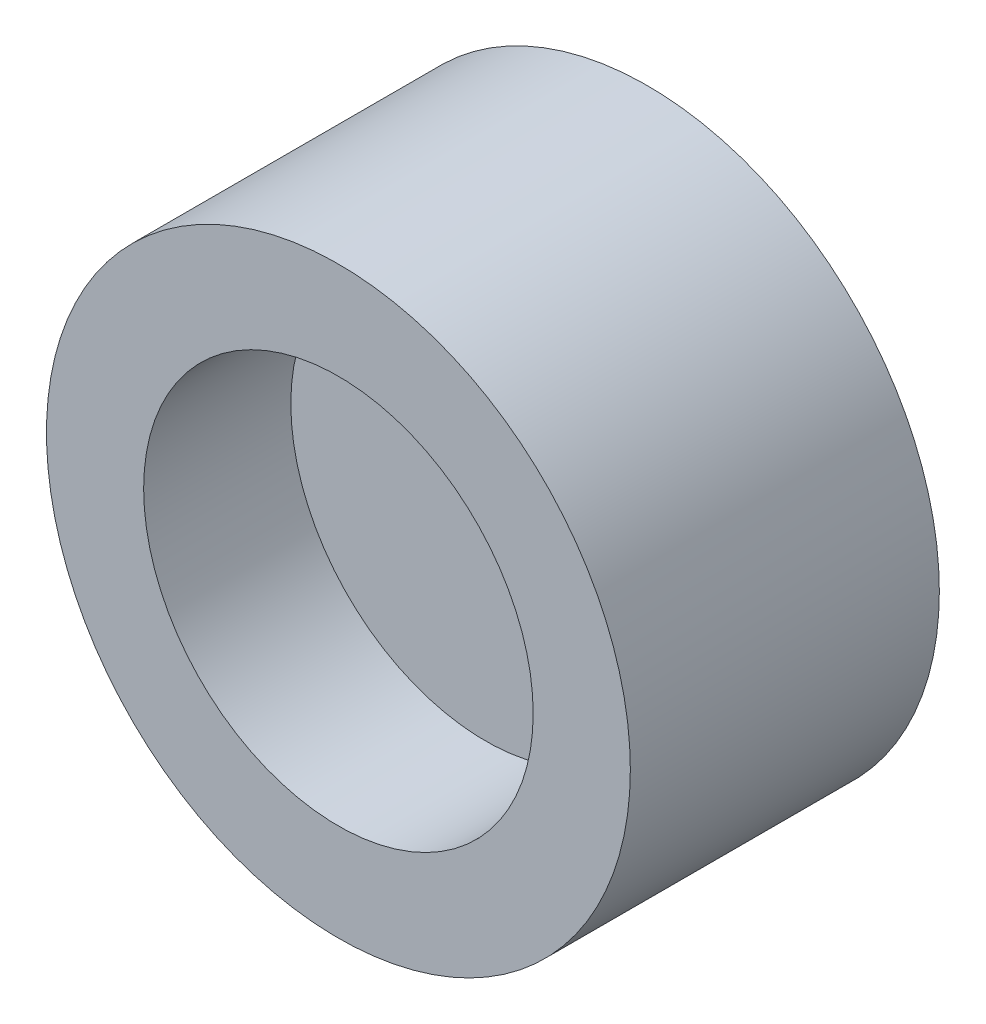
ISO-10303-21;
HEADER;
FILE_DESCRIPTION(('STEP AP214'),'2;1');
FILE_NAME('part.step','',(''),(''),'','','');
FILE_SCHEMA(('AUTOMOTIVE_DESIGN { 1 0 10303 214 1 1 1 1 }'));
ENDSEC;
DATA;
#1=APPLICATION_CONTEXT('core data for automotive mechanical design processes');
#2=APPLICATION_PROTOCOL_DEFINITION('international standard','automotive_design',2000,#1);
#3=PRODUCT_CONTEXT('',#1,'mechanical');
#4=PRODUCT('Part','Part','',(#3));
#5=PRODUCT_RELATED_PRODUCT_CATEGORY('part','',(#4));
#6=PRODUCT_DEFINITION_FORMATION('','',#4);
#7=PRODUCT_DEFINITION_CONTEXT('part definition',#1,'design');
#8=PRODUCT_DEFINITION('design','',#6,#7);
#9=PRODUCT_DEFINITION_SHAPE('','',#8);
#10=(LENGTH_UNIT() NAMED_UNIT(*) SI_UNIT(.MILLI.,.METRE.));
#11=(NAMED_UNIT(*) PLANE_ANGLE_UNIT() SI_UNIT($,.RADIAN.));
#12=(NAMED_UNIT(*) SI_UNIT($,.STERADIAN.) SOLID_ANGLE_UNIT());
#13=UNCERTAINTY_MEASURE_WITH_UNIT(LENGTH_MEASURE(1.E-05),#10,'distance_accuracy_value','');
#14=(GEOMETRIC_REPRESENTATION_CONTEXT(3) GLOBAL_UNCERTAINTY_ASSIGNED_CONTEXT((#13)) GLOBAL_UNIT_ASSIGNED_CONTEXT((#10,
#11,#12)) REPRESENTATION_CONTEXT('',''));
#15=CARTESIAN_POINT('',(0.,0.,0.));
#16=DIRECTION('',(0.,0.,1.));
#17=DIRECTION('',(1.,0.,0.));
#18=AXIS2_PLACEMENT_3D('',#15,#16,#17);
#19=CARTESIAN_POINT('',(0.,0.,2.07724006996025));
#20=DIRECTION('',(0.,0.,1.));
#21=DIRECTION('',(1.,0.,0.));
#22=AXIS2_PLACEMENT_3D('',#19,#20,#21);
#23=PLANE('',#22);
#24=CARTESIAN_POINT('',(0.,0.,2.07724006996025));
#25=DIRECTION('',(0.,0.,1.));
#26=DIRECTION('',(1.,0.,0.));
#27=AXIS2_PLACEMENT_3D('',#24,#25,#26);
#28=CIRCLE('',#27,2.5);
#29=CARTESIAN_POINT('',(2.5,0.,2.07724006996025));
#30=VERTEX_POINT('',#29);
#31=EDGE_CURVE('E10',#30,#30,#28,.F.);
#32=ORIENTED_EDGE('',*,*,#31,.F.);
#33=EDGE_LOOP('',(#32));
#34=FACE_BOUND('',#33,.T.);
#35=ADVANCED_FACE('F31',(#34),#23,.T.);
#36=CARTESIAN_POINT('',(0.,0.,3.96622749608321));
#37=DIRECTION('',(0.,0.,-1.));
#38=DIRECTION('',(-1.,0.,0.));
#39=AXIS2_PLACEMENT_3D('',#36,#37,#38);
#40=CYLINDRICAL_SURFACE('',#39,2.5);
#41=ORIENTED_EDGE('',*,*,#31,.T.);
#42=EDGE_LOOP('',(#41));
#43=FACE_BOUND('',#42,.T.);
#44=CARTESIAN_POINT('',(0.,0.,3.96622749608321));
#45=DIRECTION('',(0.,0.,1.));
#46=DIRECTION('',(1.,0.,0.));
#47=AXIS2_PLACEMENT_3D('',#44,#45,#46);
#48=CIRCLE('',#47,2.5);
#49=CARTESIAN_POINT('',(2.5,0.,3.96622749608321));
#50=VERTEX_POINT('',#49);
#51=EDGE_CURVE('E42',#50,#50,#48,.T.);
#52=ORIENTED_EDGE('',*,*,#51,.T.);
#53=EDGE_LOOP('',(#52));
#54=FACE_BOUND('',#53,.T.);
#55=ADVANCED_FACE('F62',(#43,#54),#40,.F.);
#56=CARTESIAN_POINT('',(0.,0.,3.96622749608321));
#57=DIRECTION('',(0.,0.,-1.));
#58=DIRECTION('',(-1.,0.,0.));
#59=AXIS2_PLACEMENT_3D('',#56,#57,#58);
#60=CYLINDRICAL_SURFACE('',#59,3.74717914425611);
#61=CARTESIAN_POINT('',(0.,0.,3.96622749608321));
#62=DIRECTION('',(0.,0.,1.));
#63=DIRECTION('',(1.,0.,0.));
#64=AXIS2_PLACEMENT_3D('',#61,#62,#63);
#65=CIRCLE('',#64,3.74717914425611);
#66=CARTESIAN_POINT('',(3.74717914425611,0.,3.96622749608321));
#67=VERTEX_POINT('',#66);
#68=EDGE_CURVE('E38',#67,#67,#65,.T.);
#69=ORIENTED_EDGE('',*,*,#68,.F.);
#70=EDGE_LOOP('',(#69));
#71=FACE_BOUND('',#70,.T.);
#72=CARTESIAN_POINT('',(0.,0.,0.));
#73=DIRECTION('',(0.,0.,1.));
#74=DIRECTION('',(1.,0.,0.));
#75=AXIS2_PLACEMENT_3D('',#72,#73,#74);
#76=CIRCLE('',#75,3.74717914425611);
#77=CARTESIAN_POINT('',(3.74717914425611,0.,0.));
#78=VERTEX_POINT('',#77);
#79=EDGE_CURVE('E47',#78,#78,#76,.T.);
#80=ORIENTED_EDGE('',*,*,#79,.T.);
#81=EDGE_LOOP('',(#80));
#82=FACE_BOUND('',#81,.T.);
#83=ADVANCED_FACE('F52',(#71,#82),#60,.T.);
#84=CARTESIAN_POINT('',(0.,0.,3.96622749608321));
#85=DIRECTION('',(0.,0.,1.));
#86=DIRECTION('',(1.,0.,0.));
#87=AXIS2_PLACEMENT_3D('',#84,#85,#86);
#88=PLANE('',#87);
#89=ORIENTED_EDGE('',*,*,#51,.F.);
#90=EDGE_LOOP('',(#89));
#91=FACE_BOUND('',#90,.T.);
#92=ORIENTED_EDGE('',*,*,#68,.T.);
#93=EDGE_LOOP('',(#92));
#94=FACE_BOUND('',#93,.T.);
#95=ADVANCED_FACE('F55',(#91,#94),#88,.T.);
#96=CARTESIAN_POINT('',(0.,0.,0.));
#97=DIRECTION('',(0.,0.,1.));
#98=DIRECTION('',(1.,0.,0.));
#99=AXIS2_PLACEMENT_3D('',#96,#97,#98);
#100=PLANE('',#99);
#101=ORIENTED_EDGE('',*,*,#79,.F.);
#102=EDGE_LOOP('',(#101));
#103=FACE_BOUND('',#102,.T.);
#104=ADVANCED_FACE('F33',(#103),#100,.F.);
#105=CLOSED_SHELL('',(#35,#55,#83,#95,#104));
#106=MANIFOLD_SOLID_BREP('B2',#105);
#107=ADVANCED_BREP_SHAPE_REPRESENTATION('',(#18,#106),#14);
#108=SHAPE_DEFINITION_REPRESENTATION(#9,#107);
ENDSEC;
END-ISO-10303-21;
